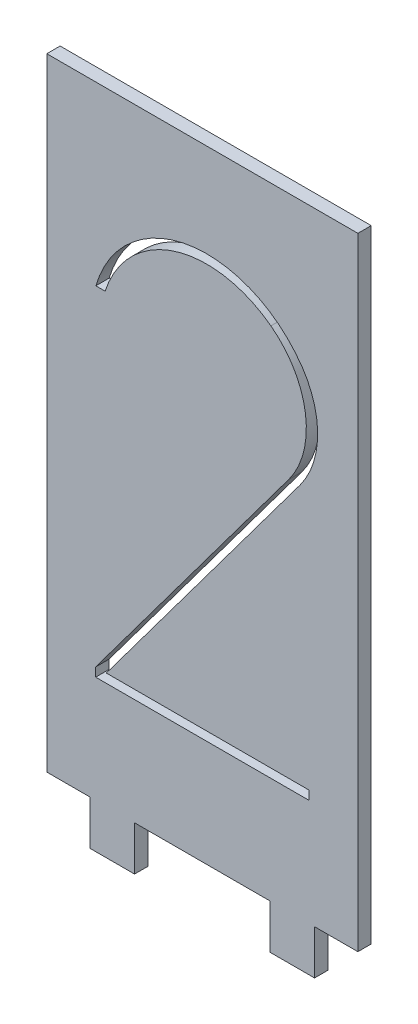
ISO-10303-21;
HEADER;
FILE_DESCRIPTION(('STEP AP214'),'2;1');
FILE_NAME('part.step','',(''),(''),'','','');
FILE_SCHEMA(('AUTOMOTIVE_DESIGN { 1 0 10303 214 1 1 1 1 }'));
ENDSEC;
DATA;
#1=APPLICATION_CONTEXT('core data for automotive mechanical design processes');
#2=APPLICATION_PROTOCOL_DEFINITION('international standard','automotive_design',2000,#1);
#3=PRODUCT_CONTEXT('',#1,'mechanical');
#4=PRODUCT('Part','Part','',(#3));
#5=PRODUCT_RELATED_PRODUCT_CATEGORY('part','',(#4));
#6=PRODUCT_DEFINITION_FORMATION('','',#4);
#7=PRODUCT_DEFINITION_CONTEXT('part definition',#1,'design');
#8=PRODUCT_DEFINITION('design','',#6,#7);
#9=PRODUCT_DEFINITION_SHAPE('','',#8);
#10=(LENGTH_UNIT() NAMED_UNIT(*) SI_UNIT(.MILLI.,.METRE.));
#11=(NAMED_UNIT(*) PLANE_ANGLE_UNIT() SI_UNIT($,.RADIAN.));
#12=(NAMED_UNIT(*) SI_UNIT($,.STERADIAN.) SOLID_ANGLE_UNIT());
#13=UNCERTAINTY_MEASURE_WITH_UNIT(LENGTH_MEASURE(1.E-05),#10,'distance_accuracy_value','');
#14=(GEOMETRIC_REPRESENTATION_CONTEXT(3) GLOBAL_UNCERTAINTY_ASSIGNED_CONTEXT((#13)) GLOBAL_UNIT_ASSIGNED_CONTEXT((#10,
#11,#12)) REPRESENTATION_CONTEXT('',''));
#15=CARTESIAN_POINT('',(0.,0.,0.));
#16=DIRECTION('',(0.,0.,1.));
#17=DIRECTION('',(1.,0.,0.));
#18=AXIS2_PLACEMENT_3D('',#15,#16,#17);
#19=CARTESIAN_POINT('',(0.,0.,1.5));
#20=DIRECTION('',(0.,1.,0.));
#21=DIRECTION('',(0.,0.,1.));
#22=AXIS2_PLACEMENT_3D('',#19,#20,#21);
#23=PLANE('',#22);
#24=DIRECTION('',(1.,0.,0.));
#25=VECTOR('',#24,1.);
#26=CARTESIAN_POINT('',(0.,0.,1.5));
#27=LINE('',#26,#25);
#28=CARTESIAN_POINT('',(4.875,0.,1.5));
#29=VERTEX_POINT('',#28);
#30=CARTESIAN_POINT('',(9.875,0.,1.5));
#31=VERTEX_POINT('',#30);
#32=EDGE_CURVE('E365',#29,#31,#27,.T.);
#33=ORIENTED_EDGE('',*,*,#32,.F.);
#34=DIRECTION('',(0.,0.,1.));
#35=VECTOR('',#34,1.);
#36=CARTESIAN_POINT('',(4.875,0.,-18.5));
#37=LINE('',#36,#35);
#38=CARTESIAN_POINT('',(4.875,0.,0.));
#39=VERTEX_POINT('',#38);
#40=EDGE_CURVE('E302',#39,#29,#37,.T.);
#41=ORIENTED_EDGE('',*,*,#40,.F.);
#42=DIRECTION('',(1.,0.,0.));
#43=VECTOR('',#42,1.);
#44=CARTESIAN_POINT('',(0.,0.,0.));
#45=LINE('',#44,#43);
#46=CARTESIAN_POINT('',(9.875,0.,0.));
#47=VERTEX_POINT('',#46);
#48=EDGE_CURVE('E380',#39,#47,#45,.T.);
#49=ORIENTED_EDGE('',*,*,#48,.T.);
#50=DIRECTION('',(0.,0.,1.));
#51=VECTOR('',#50,1.);
#52=CARTESIAN_POINT('',(9.875,0.,-18.5));
#53=LINE('',#52,#51);
#54=EDGE_CURVE('E342',#47,#31,#53,.T.);
#55=ORIENTED_EDGE('',*,*,#54,.T.);
#56=EDGE_LOOP('',(#33,#41,#49,#55));
#57=FACE_BOUND('',#56,.T.);
#58=ADVANCED_FACE('F38',(#57),#23,.F.);
#59=CARTESIAN_POINT('',(0.,0.,1.5));
#60=DIRECTION('',(1.,0.,0.));
#61=DIRECTION('',(0.,1.,0.));
#62=AXIS2_PLACEMENT_3D('',#59,#60,#61);
#63=PLANE('',#62);
#64=DIRECTION('',(0.,-1.,0.));
#65=VECTOR('',#64,1.);
#66=CARTESIAN_POINT('',(0.,0.,0.));
#67=LINE('',#66,#65);
#68=CARTESIAN_POINT('',(0.,75.,0.));
#69=VERTEX_POINT('',#68);
#70=CARTESIAN_POINT('',(0.,5.,0.));
#71=VERTEX_POINT('',#70);
#72=EDGE_CURVE('E346',#69,#71,#67,.T.);
#73=ORIENTED_EDGE('',*,*,#72,.T.);
#74=DIRECTION('',(0.,0.,1.));
#75=VECTOR('',#74,1.);
#76=CARTESIAN_POINT('',(0.,5.,-18.5));
#77=LINE('',#76,#75);
#78=CARTESIAN_POINT('',(0.,5.,1.5));
#79=VERTEX_POINT('',#78);
#80=EDGE_CURVE('E326',#71,#79,#77,.T.);
#81=ORIENTED_EDGE('',*,*,#80,.T.);
#82=DIRECTION('',(0.,-1.,0.));
#83=VECTOR('',#82,1.);
#84=CARTESIAN_POINT('',(0.,0.,1.5));
#85=LINE('',#84,#83);
#86=CARTESIAN_POINT('',(0.,75.,1.5));
#87=VERTEX_POINT('',#86);
#88=EDGE_CURVE('E356',#87,#79,#85,.T.);
#89=ORIENTED_EDGE('',*,*,#88,.F.);
#90=DIRECTION('',(0.,0.,-1.));
#91=VECTOR('',#90,1.);
#92=CARTESIAN_POINT('',(0.,75.,1.5));
#93=LINE('',#92,#91);
#94=EDGE_CURVE('E372',#87,#69,#93,.T.);
#95=ORIENTED_EDGE('',*,*,#94,.T.);
#96=EDGE_LOOP('',(#73,#81,#89,#95));
#97=FACE_BOUND('',#96,.T.);
#98=ADVANCED_FACE('F466',(#97),#63,.F.);
#99=CARTESIAN_POINT('',(25.125,0.,0.));
#100=VERTEX_POINT('',#99);
#101=CARTESIAN_POINT('',(30.125,0.,0.));
#102=VERTEX_POINT('',#101);
#103=EDGE_CURVE('E376',#100,#102,#45,.T.);
#104=ORIENTED_EDGE('',*,*,#103,.T.);
#105=DIRECTION('',(0.,0.,1.));
#106=VECTOR('',#105,1.);
#107=CARTESIAN_POINT('',(30.125,0.,-18.5));
#108=LINE('',#107,#106);
#109=CARTESIAN_POINT('',(30.125,0.,1.5));
#110=VERTEX_POINT('',#109);
#111=EDGE_CURVE('E306',#102,#110,#108,.T.);
#112=ORIENTED_EDGE('',*,*,#111,.T.);
#113=CARTESIAN_POINT('',(25.125,0.,1.5));
#114=VERTEX_POINT('',#113);
#115=EDGE_CURVE('E360',#114,#110,#27,.T.);
#116=ORIENTED_EDGE('',*,*,#115,.F.);
#117=DIRECTION('',(0.,0.,1.));
#118=VECTOR('',#117,1.);
#119=CARTESIAN_POINT('',(25.125,0.,-18.5));
#120=LINE('',#119,#118);
#121=EDGE_CURVE('E350',#100,#114,#120,.T.);
#122=ORIENTED_EDGE('',*,*,#121,.F.);
#123=EDGE_LOOP('',(#104,#112,#116,#122));
#124=FACE_BOUND('',#123,.T.);
#125=ADVANCED_FACE('F488',(#124),#23,.F.);
#126=CARTESIAN_POINT('',(35.,0.,1.5));
#127=DIRECTION('',(-1.,0.,0.));
#128=DIRECTION('',(0.,-1.,0.));
#129=AXIS2_PLACEMENT_3D('',#126,#127,#128);
#130=PLANE('',#129);
#131=DIRECTION('',(0.,1.,0.));
#132=VECTOR('',#131,1.);
#133=CARTESIAN_POINT('',(35.,0.,1.5));
#134=LINE('',#133,#132);
#135=CARTESIAN_POINT('',(35.,5.,1.5));
#136=VERTEX_POINT('',#135);
#137=CARTESIAN_POINT('',(35.,75.,1.5));
#138=VERTEX_POINT('',#137);
#139=EDGE_CURVE('E366',#136,#138,#134,.T.);
#140=ORIENTED_EDGE('',*,*,#139,.F.);
#141=DIRECTION('',(0.,0.,1.));
#142=VECTOR('',#141,1.);
#143=CARTESIAN_POINT('',(35.,5.,-18.5));
#144=LINE('',#143,#142);
#145=CARTESIAN_POINT('',(35.,5.,0.));
#146=VERTEX_POINT('',#145);
#147=EDGE_CURVE('E311',#146,#136,#144,.T.);
#148=ORIENTED_EDGE('',*,*,#147,.F.);
#149=DIRECTION('',(0.,1.,0.));
#150=VECTOR('',#149,1.);
#151=CARTESIAN_POINT('',(35.,0.,0.));
#152=LINE('',#151,#150);
#153=CARTESIAN_POINT('',(35.,75.,0.));
#154=VERTEX_POINT('',#153);
#155=EDGE_CURVE('E381',#146,#154,#152,.T.);
#156=ORIENTED_EDGE('',*,*,#155,.T.);
#157=DIRECTION('',(0.,0.,-1.));
#158=VECTOR('',#157,1.);
#159=CARTESIAN_POINT('',(35.,75.,1.5));
#160=LINE('',#159,#158);
#161=EDGE_CURVE('E389',#138,#154,#160,.T.);
#162=ORIENTED_EDGE('',*,*,#161,.F.);
#163=EDGE_LOOP('',(#140,#148,#156,#162));
#164=FACE_BOUND('',#163,.T.);
#165=ADVANCED_FACE('F479',(#164),#130,.F.);
#166=CARTESIAN_POINT('',(0.,75.,1.5));
#167=DIRECTION('',(0.,-1.,0.));
#168=DIRECTION('',(0.,0.,-1.));
#169=AXIS2_PLACEMENT_3D('',#166,#167,#168);
#170=PLANE('',#169);
#171=DIRECTION('',(-1.,0.,0.));
#172=VECTOR('',#171,1.);
#173=CARTESIAN_POINT('',(0.,75.,0.));
#174=LINE('',#173,#172);
#175=EDGE_CURVE('E361',#154,#69,#174,.T.);
#176=ORIENTED_EDGE('',*,*,#175,.T.);
#177=ORIENTED_EDGE('',*,*,#94,.F.);
#178=DIRECTION('',(-1.,0.,0.));
#179=VECTOR('',#178,1.);
#180=CARTESIAN_POINT('',(0.,75.,1.5));
#181=LINE('',#180,#179);
#182=EDGE_CURVE('E369',#138,#87,#181,.T.);
#183=ORIENTED_EDGE('',*,*,#182,.F.);
#184=ORIENTED_EDGE('',*,*,#161,.T.);
#185=EDGE_LOOP('',(#176,#177,#183,#184));
#186=FACE_BOUND('',#185,.T.);
#187=ADVANCED_FACE('F471',(#186),#170,.F.);
#188=CARTESIAN_POINT('',(0.,0.,1.5));
#189=DIRECTION('',(0.,0.,-1.));
#190=DIRECTION('',(-1.,0.,0.));
#191=AXIS2_PLACEMENT_3D('',#188,#189,#190);
#192=PLANE('',#191);
#193=DIRECTION('',(-0.59786551853371,-0.801596420743268,0.));
#194=VECTOR('',#193,1.);
#195=CARTESIAN_POINT('',(29.9808930630456,50.8230942370857,1.5));
#196=LINE('',#195,#194);
#197=CARTESIAN_POINT('',(27.2185296667036,47.1194175026745,1.5));
#198=VERTEX_POINT('',#197);
#199=CARTESIAN_POINT('',(5.49999999999999,18.,1.5));
#200=VERTEX_POINT('',#199);
#201=EDGE_CURVE('E257',#198,#200,#196,.T.);
#202=ORIENTED_EDGE('',*,*,#201,.F.);
#203=CARTESIAN_POINT('',(19.2025654592709,53.0980726880116,1.5));
#204=DIRECTION('',(0.,0.,-1.));
#205=DIRECTION('',(-1.,0.,0.));
#206=AXIS2_PLACEMENT_3D('',#203,#204,#205);
#207=CIRCLE('',#206,10.);
#208=CARTESIAN_POINT('',(25.2153927556252,61.0884361280696,1.5));
#209=VERTEX_POINT('',#208);
#210=EDGE_CURVE('E61',#198,#209,#207,.F.);
#211=ORIENTED_EDGE('',*,*,#210,.T.);
#212=CARTESIAN_POINT('',(18.,51.5,1.5));
#213=DIRECTION('',(0.,0.,-1.));
#214=DIRECTION('',(-1.,0.,0.));
#215=AXIS2_PLACEMENT_3D('',#212,#213,#214);
#216=CIRCLE('',#215,12.);
#217=CARTESIAN_POINT('',(6.5662215065745,55.142623966769,1.5));
#218=VERTEX_POINT('',#217);
#219=EDGE_CURVE('E254',#218,#209,#216,.T.);
#220=ORIENTED_EDGE('',*,*,#219,.F.);
#221=DIRECTION('',(1.,0.,0.));
#222=VECTOR('',#221,1.);
#223=CARTESIAN_POINT('',(6.5662215065745,55.142623966769,1.5));
#224=LINE('',#223,#222);
#225=CARTESIAN_POINT('',(5.52076562297513,55.1426239667691,1.5));
#226=VERTEX_POINT('',#225);
#227=EDGE_CURVE('E251',#226,#218,#224,.T.);
#228=ORIENTED_EDGE('',*,*,#227,.F.);
#229=CARTESIAN_POINT('',(18.,51.5,1.5));
#230=DIRECTION('',(0.,0.,1.));
#231=DIRECTION('',(-1.,0.,0.));
#232=AXIS2_PLACEMENT_3D('',#229,#230,#231);
#233=CIRCLE('',#232,13.);
#234=CARTESIAN_POINT('',(28.7253216550467,58.8462558760083,1.5));
#235=VERTEX_POINT('',#234);
#236=EDGE_CURVE('E212',#235,#226,#233,.T.);
#237=ORIENTED_EDGE('',*,*,#236,.F.);
#238=CARTESIAN_POINT('',(20.4750742280877,53.1952898175404,1.5));
#239=DIRECTION('',(0.,0.,-1.));
#240=DIRECTION('',(-1.,0.,0.));
#241=AXIS2_PLACEMENT_3D('',#238,#239,#240);
#242=CIRCLE('',#241,10.);
#243=CARTESIAN_POINT('',(28.4910384355204,47.2166346322033,1.5));
#244=VERTEX_POINT('',#243);
#245=EDGE_CURVE('E422',#235,#244,#242,.T.);
#246=ORIENTED_EDGE('',*,*,#245,.T.);
#247=DIRECTION('',(0.59786551853371,0.801596420743268,0.));
#248=VECTOR('',#247,1.);
#249=CARTESIAN_POINT('',(6.69999999999999,18.,1.5));
#250=LINE('',#249,#248);
#251=CARTESIAN_POINT('',(6.69999999999999,18.,1.5));
#252=VERTEX_POINT('',#251);
#253=EDGE_CURVE('E206',#252,#244,#250,.T.);
#254=ORIENTED_EDGE('',*,*,#253,.F.);
#255=DIRECTION('',(-1.,0.,0.));
#256=VECTOR('',#255,1.);
#257=CARTESIAN_POINT('',(29.5,18.,1.5));
#258=LINE('',#257,#256);
#259=CARTESIAN_POINT('',(29.5,18.,1.5));
#260=VERTEX_POINT('',#259);
#261=EDGE_CURVE('E272',#260,#252,#258,.T.);
#262=ORIENTED_EDGE('',*,*,#261,.F.);
#263=DIRECTION('',(0.,1.,0.));
#264=VECTOR('',#263,1.);
#265=CARTESIAN_POINT('',(29.5,17.,1.5));
#266=LINE('',#265,#264);
#267=CARTESIAN_POINT('',(29.5,17.,1.5));
#268=VERTEX_POINT('',#267);
#269=EDGE_CURVE('E268',#268,#260,#266,.T.);
#270=ORIENTED_EDGE('',*,*,#269,.F.);
#271=DIRECTION('',(1.,0.,0.));
#272=VECTOR('',#271,1.);
#273=CARTESIAN_POINT('',(5.49999999999999,17.,1.5));
#274=LINE('',#273,#272);
#275=CARTESIAN_POINT('',(5.49999999999999,17.,1.5));
#276=VERTEX_POINT('',#275);
#277=EDGE_CURVE('E264',#276,#268,#274,.T.);
#278=ORIENTED_EDGE('',*,*,#277,.F.);
#279=DIRECTION('',(0.,-1.,0.));
#280=VECTOR('',#279,1.);
#281=CARTESIAN_POINT('',(5.49999999999999,18.,1.5));
#282=LINE('',#281,#280);
#283=EDGE_CURVE('E260',#200,#276,#282,.T.);
#284=ORIENTED_EDGE('',*,*,#283,.F.);
#285=EDGE_LOOP('',(#202,#211,#220,#228,#237,#246,#254,#262,#270,#278,#284));
#286=FACE_BOUND('',#285,.T.);
#287=DIRECTION('',(-1.,0.,0.));
#288=VECTOR('',#287,1.);
#289=CARTESIAN_POINT('',(4.875,5.,1.5));
#290=LINE('',#289,#288);
#291=CARTESIAN_POINT('',(4.875,5.,1.5));
#292=VERTEX_POINT('',#291);
#293=EDGE_CURVE('E320',#292,#79,#290,.T.);
#294=ORIENTED_EDGE('',*,*,#293,.F.);
#295=DIRECTION('',(0.,1.,0.));
#296=VECTOR('',#295,1.);
#297=CARTESIAN_POINT('',(4.875,5.,1.5));
#298=LINE('',#297,#296);
#299=EDGE_CURVE('E282',#29,#292,#298,.T.);
#300=ORIENTED_EDGE('',*,*,#299,.F.);
#301=ORIENTED_EDGE('',*,*,#32,.T.);
#302=DIRECTION('',(0.,-1.,0.));
#303=VECTOR('',#302,1.);
#304=CARTESIAN_POINT('',(9.875,0.,1.5));
#305=LINE('',#304,#303);
#306=CARTESIAN_POINT('',(9.875,5.,1.5));
#307=VERTEX_POINT('',#306);
#308=EDGE_CURVE('E310',#307,#31,#305,.T.);
#309=ORIENTED_EDGE('',*,*,#308,.F.);
#310=DIRECTION('',(-1.,0.,0.));
#311=VECTOR('',#310,1.);
#312=CARTESIAN_POINT('',(9.875,5.,1.5));
#313=LINE('',#312,#311);
#314=CARTESIAN_POINT('',(25.125,5.,1.5));
#315=VERTEX_POINT('',#314);
#316=EDGE_CURVE('E338',#315,#307,#313,.T.);
#317=ORIENTED_EDGE('',*,*,#316,.F.);
#318=DIRECTION('',(0.,1.,0.));
#319=VECTOR('',#318,1.);
#320=CARTESIAN_POINT('',(25.125,0.,1.5));
#321=LINE('',#320,#319);
#322=EDGE_CURVE('E334',#114,#315,#321,.T.);
#323=ORIENTED_EDGE('',*,*,#322,.F.);
#324=ORIENTED_EDGE('',*,*,#115,.T.);
#325=DIRECTION('',(0.,-1.,0.));
#326=VECTOR('',#325,1.);
#327=CARTESIAN_POINT('',(30.125,5.,1.5));
#328=LINE('',#327,#326);
#329=CARTESIAN_POINT('',(30.125,5.,1.5));
#330=VERTEX_POINT('',#329);
#331=EDGE_CURVE('E298',#330,#110,#328,.T.);
#332=ORIENTED_EDGE('',*,*,#331,.F.);
#333=DIRECTION('',(-1.,0.,0.));
#334=VECTOR('',#333,1.);
#335=CARTESIAN_POINT('',(30.125,5.,1.5));
#336=LINE('',#335,#334);
#337=EDGE_CURVE('E301',#136,#330,#336,.T.);
#338=ORIENTED_EDGE('',*,*,#337,.F.);
#339=ORIENTED_EDGE('',*,*,#139,.T.);
#340=ORIENTED_EDGE('',*,*,#182,.T.);
#341=ORIENTED_EDGE('',*,*,#88,.T.);
#342=EDGE_LOOP('',(#294,#300,#301,#309,#317,#323,#324,#332,#338,#339,#340,#341));
#343=FACE_BOUND('',#342,.T.);
#344=ADVANCED_FACE('F456',(#286,#343),#192,.F.);
#345=CARTESIAN_POINT('',(0.,0.,0.));
#346=DIRECTION('',(0.,0.,-1.));
#347=DIRECTION('',(-1.,0.,0.));
#348=AXIS2_PLACEMENT_3D('',#345,#346,#347);
#349=PLANE('',#348);
#350=CARTESIAN_POINT('',(18.,51.5,0.));
#351=DIRECTION('',(0.,0.,-1.));
#352=DIRECTION('',(-1.,0.,0.));
#353=AXIS2_PLACEMENT_3D('',#350,#351,#352);
#354=CIRCLE('',#353,12.);
#355=CARTESIAN_POINT('',(6.5662215065745,55.142623966769,0.));
#356=VERTEX_POINT('',#355);
#357=CARTESIAN_POINT('',(25.2153927556252,61.0884361280696,0.));
#358=VERTEX_POINT('',#357);
#359=EDGE_CURVE('E223',#356,#358,#354,.T.);
#360=ORIENTED_EDGE('',*,*,#359,.T.);
#361=CARTESIAN_POINT('',(19.2025654592709,53.0980726880116,0.));
#362=DIRECTION('',(0.,0.,-1.));
#363=DIRECTION('',(-1.,0.,0.));
#364=AXIS2_PLACEMENT_3D('',#361,#362,#363);
#365=CIRCLE('',#364,10.);
#366=CARTESIAN_POINT('',(27.2185296667036,47.1194175026745,0.));
#367=VERTEX_POINT('',#366);
#368=EDGE_CURVE('E11',#358,#367,#365,.T.);
#369=ORIENTED_EDGE('',*,*,#368,.T.);
#370=DIRECTION('',(-0.59786551853371,-0.801596420743268,0.));
#371=VECTOR('',#370,1.);
#372=CARTESIAN_POINT('',(29.9808930630456,50.8230942370857,0.));
#373=LINE('',#372,#371);
#374=CARTESIAN_POINT('',(5.49999999999999,18.,0.));
#375=VERTEX_POINT('',#374);
#376=EDGE_CURVE('E226',#367,#375,#373,.T.);
#377=ORIENTED_EDGE('',*,*,#376,.T.);
#378=DIRECTION('',(0.,-1.,0.));
#379=VECTOR('',#378,1.);
#380=CARTESIAN_POINT('',(5.49999999999999,18.,0.));
#381=LINE('',#380,#379);
#382=CARTESIAN_POINT('',(5.49999999999999,17.,0.));
#383=VERTEX_POINT('',#382);
#384=EDGE_CURVE('E231',#375,#383,#381,.T.);
#385=ORIENTED_EDGE('',*,*,#384,.T.);
#386=DIRECTION('',(1.,0.,0.));
#387=VECTOR('',#386,1.);
#388=CARTESIAN_POINT('',(5.49999999999999,17.,0.));
#389=LINE('',#388,#387);
#390=CARTESIAN_POINT('',(29.5,17.,0.));
#391=VERTEX_POINT('',#390);
#392=EDGE_CURVE('E235',#383,#391,#389,.T.);
#393=ORIENTED_EDGE('',*,*,#392,.T.);
#394=DIRECTION('',(0.,1.,0.));
#395=VECTOR('',#394,1.);
#396=CARTESIAN_POINT('',(29.5,17.,0.));
#397=LINE('',#396,#395);
#398=CARTESIAN_POINT('',(29.5,18.,0.));
#399=VERTEX_POINT('',#398);
#400=EDGE_CURVE('E239',#391,#399,#397,.T.);
#401=ORIENTED_EDGE('',*,*,#400,.T.);
#402=DIRECTION('',(-1.,0.,0.));
#403=VECTOR('',#402,1.);
#404=CARTESIAN_POINT('',(29.5,18.,0.));
#405=LINE('',#404,#403);
#406=CARTESIAN_POINT('',(6.69999999999999,18.,0.));
#407=VERTEX_POINT('',#406);
#408=EDGE_CURVE('E243',#399,#407,#405,.T.);
#409=ORIENTED_EDGE('',*,*,#408,.T.);
#410=DIRECTION('',(0.59786551853371,0.801596420743268,0.));
#411=VECTOR('',#410,1.);
#412=CARTESIAN_POINT('',(6.69999999999999,18.,0.));
#413=LINE('',#412,#411);
#414=CARTESIAN_POINT('',(28.4910384355204,47.2166346322033,0.));
#415=VERTEX_POINT('',#414);
#416=EDGE_CURVE('E218',#407,#415,#413,.T.);
#417=ORIENTED_EDGE('',*,*,#416,.T.);
#418=CARTESIAN_POINT('',(20.4750742280877,53.1952898175404,0.));
#419=DIRECTION('',(0.,0.,-1.));
#420=DIRECTION('',(-1.,0.,0.));
#421=AXIS2_PLACEMENT_3D('',#418,#419,#420);
#422=CIRCLE('',#421,10.);
#423=CARTESIAN_POINT('',(28.7253216550467,58.8462558760083,0.));
#424=VERTEX_POINT('',#423);
#425=EDGE_CURVE('E201',#415,#424,#422,.F.);
#426=ORIENTED_EDGE('',*,*,#425,.T.);
#427=CARTESIAN_POINT('',(18.,51.5,0.));
#428=DIRECTION('',(0.,0.,1.));
#429=DIRECTION('',(-1.,0.,0.));
#430=AXIS2_PLACEMENT_3D('',#427,#428,#429);
#431=CIRCLE('',#430,13.);
#432=CARTESIAN_POINT('',(5.52076562297513,55.1426239667691,0.));
#433=VERTEX_POINT('',#432);
#434=EDGE_CURVE('E193',#424,#433,#431,.T.);
#435=ORIENTED_EDGE('',*,*,#434,.T.);
#436=DIRECTION('',(1.,0.,0.));
#437=VECTOR('',#436,1.);
#438=CARTESIAN_POINT('',(6.5662215065745,55.142623966769,0.));
#439=LINE('',#438,#437);
#440=EDGE_CURVE('E198',#433,#356,#439,.T.);
#441=ORIENTED_EDGE('',*,*,#440,.T.);
#442=EDGE_LOOP('',(#360,#369,#377,#385,#393,#401,#409,#417,#426,#435,#441));
#443=FACE_BOUND('',#442,.T.);
#444=DIRECTION('',(0.,-1.,0.));
#445=VECTOR('',#444,1.);
#446=CARTESIAN_POINT('',(4.875,0.,0.));
#447=LINE('',#446,#445);
#448=CARTESIAN_POINT('',(4.875,5.,0.));
#449=VERTEX_POINT('',#448);
#450=EDGE_CURVE('E413',#449,#39,#447,.T.);
#451=ORIENTED_EDGE('',*,*,#450,.F.);
#452=DIRECTION('',(1.,0.,0.));
#453=VECTOR('',#452,1.);
#454=CARTESIAN_POINT('',(0.,5.,0.));
#455=LINE('',#454,#453);
#456=EDGE_CURVE('E410',#71,#449,#455,.T.);
#457=ORIENTED_EDGE('',*,*,#456,.F.);
#458=ORIENTED_EDGE('',*,*,#72,.F.);
#459=ORIENTED_EDGE('',*,*,#175,.F.);
#460=ORIENTED_EDGE('',*,*,#155,.F.);
#461=DIRECTION('',(1.,0.,0.));
#462=VECTOR('',#461,1.);
#463=CARTESIAN_POINT('',(0.,5.,0.));
#464=LINE('',#463,#462);
#465=CARTESIAN_POINT('',(30.125,5.,0.));
#466=VERTEX_POINT('',#465);
#467=EDGE_CURVE('E403',#466,#146,#464,.T.);
#468=ORIENTED_EDGE('',*,*,#467,.F.);
#469=DIRECTION('',(0.,1.,0.));
#470=VECTOR('',#469,1.);
#471=CARTESIAN_POINT('',(30.125,0.,0.));
#472=LINE('',#471,#470);
#473=EDGE_CURVE('E406',#102,#466,#472,.T.);
#474=ORIENTED_EDGE('',*,*,#473,.F.);
#475=ORIENTED_EDGE('',*,*,#103,.F.);
#476=DIRECTION('',(0.,-1.,0.));
#477=VECTOR('',#476,1.);
#478=CARTESIAN_POINT('',(25.125,0.,0.));
#479=LINE('',#478,#477);
#480=CARTESIAN_POINT('',(25.125,5.,0.));
#481=VERTEX_POINT('',#480);
#482=EDGE_CURVE('E393',#481,#100,#479,.T.);
#483=ORIENTED_EDGE('',*,*,#482,.F.);
#484=DIRECTION('',(1.,0.,0.));
#485=VECTOR('',#484,1.);
#486=CARTESIAN_POINT('',(0.,5.,0.));
#487=LINE('',#486,#485);
#488=CARTESIAN_POINT('',(9.875,5.,0.));
#489=VERTEX_POINT('',#488);
#490=EDGE_CURVE('E396',#489,#481,#487,.T.);
#491=ORIENTED_EDGE('',*,*,#490,.F.);
#492=DIRECTION('',(0.,1.,0.));
#493=VECTOR('',#492,1.);
#494=CARTESIAN_POINT('',(9.875,0.,0.));
#495=LINE('',#494,#493);
#496=EDGE_CURVE('E400',#47,#489,#495,.T.);
#497=ORIENTED_EDGE('',*,*,#496,.F.);
#498=ORIENTED_EDGE('',*,*,#48,.F.);
#499=EDGE_LOOP('',(#451,#457,#458,#459,#460,#468,#474,#475,#483,#491,#497,#498));
#500=FACE_BOUND('',#499,.T.);
#501=ADVANCED_FACE('F195',(#443,#500),#349,.T.);
#502=CARTESIAN_POINT('',(9.875,0.,-18.5));
#503=DIRECTION('',(-1.,0.,0.));
#504=DIRECTION('',(0.,-1.,0.));
#505=AXIS2_PLACEMENT_3D('',#502,#503,#504);
#506=PLANE('',#505);
#507=ORIENTED_EDGE('',*,*,#496,.T.);
#508=DIRECTION('',(0.,0.,1.));
#509=VECTOR('',#508,1.);
#510=CARTESIAN_POINT('',(9.875,5.,-18.5));
#511=LINE('',#510,#509);
#512=EDGE_CURVE('E343',#489,#307,#511,.T.);
#513=ORIENTED_EDGE('',*,*,#512,.T.);
#514=ORIENTED_EDGE('',*,*,#308,.T.);
#515=ORIENTED_EDGE('',*,*,#54,.F.);
#516=EDGE_LOOP('',(#507,#513,#514,#515));
#517=FACE_BOUND('',#516,.T.);
#518=ADVANCED_FACE('F448',(#517),#506,.F.);
#519=CARTESIAN_POINT('',(9.875,5.,-18.5));
#520=DIRECTION('',(0.,1.,0.));
#521=DIRECTION('',(0.,0.,1.));
#522=AXIS2_PLACEMENT_3D('',#519,#520,#521);
#523=PLANE('',#522);
#524=ORIENTED_EDGE('',*,*,#490,.T.);
#525=DIRECTION('',(0.,0.,1.));
#526=VECTOR('',#525,1.);
#527=CARTESIAN_POINT('',(25.125,5.,-18.5));
#528=LINE('',#527,#526);
#529=EDGE_CURVE('E347',#481,#315,#528,.T.);
#530=ORIENTED_EDGE('',*,*,#529,.T.);
#531=ORIENTED_EDGE('',*,*,#316,.T.);
#532=ORIENTED_EDGE('',*,*,#512,.F.);
#533=EDGE_LOOP('',(#524,#530,#531,#532));
#534=FACE_BOUND('',#533,.T.);
#535=ADVANCED_FACE('F450',(#534),#523,.F.);
#536=CARTESIAN_POINT('',(25.125,0.,-18.5));
#537=DIRECTION('',(1.,0.,0.));
#538=DIRECTION('',(0.,0.,-1.));
#539=AXIS2_PLACEMENT_3D('',#536,#537,#538);
#540=PLANE('',#539);
#541=ORIENTED_EDGE('',*,*,#482,.T.);
#542=ORIENTED_EDGE('',*,*,#121,.T.);
#543=ORIENTED_EDGE('',*,*,#322,.T.);
#544=ORIENTED_EDGE('',*,*,#529,.F.);
#545=EDGE_LOOP('',(#541,#542,#543,#544));
#546=FACE_BOUND('',#545,.T.);
#547=ADVANCED_FACE('F492',(#546),#540,.F.);
#548=CARTESIAN_POINT('',(30.125,5.,-18.5));
#549=DIRECTION('',(-1.,0.,0.));
#550=DIRECTION('',(0.,0.,1.));
#551=AXIS2_PLACEMENT_3D('',#548,#549,#550);
#552=PLANE('',#551);
#553=ORIENTED_EDGE('',*,*,#473,.T.);
#554=DIRECTION('',(0.,0.,1.));
#555=VECTOR('',#554,1.);
#556=CARTESIAN_POINT('',(30.125,5.,-18.5));
#557=LINE('',#556,#555);
#558=EDGE_CURVE('E307',#466,#330,#557,.T.);
#559=ORIENTED_EDGE('',*,*,#558,.T.);
#560=ORIENTED_EDGE('',*,*,#331,.T.);
#561=ORIENTED_EDGE('',*,*,#111,.F.);
#562=EDGE_LOOP('',(#553,#559,#560,#561));
#563=FACE_BOUND('',#562,.T.);
#564=ADVANCED_FACE('F486',(#563),#552,.F.);
#565=CARTESIAN_POINT('',(30.125,5.,-18.5));
#566=DIRECTION('',(0.,1.,0.));
#567=DIRECTION('',(0.,0.,1.));
#568=AXIS2_PLACEMENT_3D('',#565,#566,#567);
#569=PLANE('',#568);
#570=ORIENTED_EDGE('',*,*,#467,.T.);
#571=ORIENTED_EDGE('',*,*,#147,.T.);
#572=ORIENTED_EDGE('',*,*,#337,.T.);
#573=ORIENTED_EDGE('',*,*,#558,.F.);
#574=EDGE_LOOP('',(#570,#571,#572,#573));
#575=FACE_BOUND('',#574,.T.);
#576=ADVANCED_FACE('F482',(#575),#569,.F.);
#577=CARTESIAN_POINT('',(4.875,5.,-18.5));
#578=DIRECTION('',(1.,0.,0.));
#579=DIRECTION('',(0.,1.,0.));
#580=AXIS2_PLACEMENT_3D('',#577,#578,#579);
#581=PLANE('',#580);
#582=ORIENTED_EDGE('',*,*,#450,.T.);
#583=ORIENTED_EDGE('',*,*,#40,.T.);
#584=ORIENTED_EDGE('',*,*,#299,.T.);
#585=DIRECTION('',(0.,0.,1.));
#586=VECTOR('',#585,1.);
#587=CARTESIAN_POINT('',(4.875,5.,-18.5));
#588=LINE('',#587,#586);
#589=EDGE_CURVE('E323',#449,#292,#588,.T.);
#590=ORIENTED_EDGE('',*,*,#589,.F.);
#591=EDGE_LOOP('',(#582,#583,#584,#590));
#592=FACE_BOUND('',#591,.T.);
#593=ADVANCED_FACE('F460',(#592),#581,.F.);
#594=CARTESIAN_POINT('',(4.875,5.,-18.5));
#595=DIRECTION('',(0.,1.,0.));
#596=DIRECTION('',(-1.,0.,0.));
#597=AXIS2_PLACEMENT_3D('',#594,#595,#596);
#598=PLANE('',#597);
#599=ORIENTED_EDGE('',*,*,#456,.T.);
#600=ORIENTED_EDGE('',*,*,#589,.T.);
#601=ORIENTED_EDGE('',*,*,#293,.T.);
#602=ORIENTED_EDGE('',*,*,#80,.F.);
#603=EDGE_LOOP('',(#599,#600,#601,#602));
#604=FACE_BOUND('',#603,.T.);
#605=ADVANCED_FACE('F462',(#604),#598,.F.);
#606=CARTESIAN_POINT('',(18.,51.5,0.));
#607=DIRECTION('',(0.,0.,1.));
#608=DIRECTION('',(1.,0.,0.));
#609=AXIS2_PLACEMENT_3D('',#606,#607,#608);
#610=CYLINDRICAL_SURFACE('',#609,13.);
#611=ORIENTED_EDGE('',*,*,#434,.F.);
#612=DIRECTION('',(0.,0.,1.));
#613=VECTOR('',#612,1.);
#614=CARTESIAN_POINT('',(28.7253216550467,58.8462558760083,0.));
#615=LINE('',#614,#613);
#616=EDGE_CURVE('E416',#424,#235,#615,.T.);
#617=ORIENTED_EDGE('',*,*,#616,.T.);
#618=ORIENTED_EDGE('',*,*,#236,.T.);
#619=DIRECTION('',(0.,0.,1.));
#620=VECTOR('',#619,1.);
#621=CARTESIAN_POINT('',(5.52076562297513,55.1426239667691,0.));
#622=LINE('',#621,#620);
#623=EDGE_CURVE('E209',#433,#226,#622,.T.);
#624=ORIENTED_EDGE('',*,*,#623,.F.);
#625=EDGE_LOOP('',(#611,#617,#618,#624));
#626=FACE_BOUND('',#625,.T.);
#627=ADVANCED_FACE('F210',(#626),#610,.F.);
#628=CARTESIAN_POINT('',(6.69999999999999,18.,0.));
#629=DIRECTION('',(0.801596420743268,-0.597865518533709,0.));
#630=DIRECTION('',(0.59786551853371,0.801596420743268,0.));
#631=AXIS2_PLACEMENT_3D('',#628,#629,#630);
#632=PLANE('',#631);
#633=ORIENTED_EDGE('',*,*,#253,.T.);
#634=DIRECTION('',(0.,0.,-1.));
#635=VECTOR('',#634,1.);
#636=CARTESIAN_POINT('',(28.4910384355204,47.2166346322033,0.));
#637=LINE('',#636,#635);
#638=EDGE_CURVE('E419',#244,#415,#637,.T.);
#639=ORIENTED_EDGE('',*,*,#638,.T.);
#640=ORIENTED_EDGE('',*,*,#416,.F.);
#641=DIRECTION('',(0.,0.,1.));
#642=VECTOR('',#641,1.);
#643=CARTESIAN_POINT('',(6.69999999999999,18.,0.));
#644=LINE('',#643,#642);
#645=EDGE_CURVE('E279',#407,#252,#644,.T.);
#646=ORIENTED_EDGE('',*,*,#645,.T.);
#647=EDGE_LOOP('',(#633,#639,#640,#646));
#648=FACE_BOUND('',#647,.T.);
#649=ADVANCED_FACE('F579',(#648),#632,.F.);
#650=CARTESIAN_POINT('',(29.5,18.,0.));
#651=DIRECTION('',(0.,1.,0.));
#652=DIRECTION('',(-1.,0.,0.));
#653=AXIS2_PLACEMENT_3D('',#650,#651,#652);
#654=PLANE('',#653);
#655=ORIENTED_EDGE('',*,*,#261,.T.);
#656=ORIENTED_EDGE('',*,*,#645,.F.);
#657=ORIENTED_EDGE('',*,*,#408,.F.);
#658=DIRECTION('',(0.,0.,1.));
#659=VECTOR('',#658,1.);
#660=CARTESIAN_POINT('',(29.5,18.,0.));
#661=LINE('',#660,#659);
#662=EDGE_CURVE('E283',#399,#260,#661,.T.);
#663=ORIENTED_EDGE('',*,*,#662,.T.);
#664=EDGE_LOOP('',(#655,#656,#657,#663));
#665=FACE_BOUND('',#664,.T.);
#666=ADVANCED_FACE('F573',(#665),#654,.F.);
#667=CARTESIAN_POINT('',(29.5,17.,0.));
#668=DIRECTION('',(1.,0.,0.));
#669=DIRECTION('',(0.,0.,-1.));
#670=AXIS2_PLACEMENT_3D('',#667,#668,#669);
#671=PLANE('',#670);
#672=ORIENTED_EDGE('',*,*,#269,.T.);
#673=ORIENTED_EDGE('',*,*,#662,.F.);
#674=ORIENTED_EDGE('',*,*,#400,.F.);
#675=DIRECTION('',(0.,0.,1.));
#676=VECTOR('',#675,1.);
#677=CARTESIAN_POINT('',(29.5,17.,0.));
#678=LINE('',#677,#676);
#679=EDGE_CURVE('E286',#391,#268,#678,.T.);
#680=ORIENTED_EDGE('',*,*,#679,.T.);
#681=EDGE_LOOP('',(#672,#673,#674,#680));
#682=FACE_BOUND('',#681,.T.);
#683=ADVANCED_FACE('F578',(#682),#671,.F.);
#684=CARTESIAN_POINT('',(5.49999999999999,17.,0.));
#685=DIRECTION('',(0.,-1.,0.));
#686=DIRECTION('',(0.,0.,-1.));
#687=AXIS2_PLACEMENT_3D('',#684,#685,#686);
#688=PLANE('',#687);
#689=ORIENTED_EDGE('',*,*,#277,.T.);
#690=ORIENTED_EDGE('',*,*,#679,.F.);
#691=ORIENTED_EDGE('',*,*,#392,.F.);
#692=DIRECTION('',(0.,0.,1.));
#693=VECTOR('',#692,1.);
#694=CARTESIAN_POINT('',(5.49999999999999,17.,0.));
#695=LINE('',#694,#693);
#696=EDGE_CURVE('E289',#383,#276,#695,.T.);
#697=ORIENTED_EDGE('',*,*,#696,.T.);
#698=EDGE_LOOP('',(#689,#690,#691,#697));
#699=FACE_BOUND('',#698,.T.);
#700=ADVANCED_FACE('F591',(#699),#688,.F.);
#701=CARTESIAN_POINT('',(5.49999999999999,18.,0.));
#702=DIRECTION('',(-1.,0.,0.));
#703=DIRECTION('',(0.,0.,1.));
#704=AXIS2_PLACEMENT_3D('',#701,#702,#703);
#705=PLANE('',#704);
#706=ORIENTED_EDGE('',*,*,#283,.T.);
#707=ORIENTED_EDGE('',*,*,#696,.F.);
#708=ORIENTED_EDGE('',*,*,#384,.F.);
#709=DIRECTION('',(0.,0.,1.));
#710=VECTOR('',#709,1.);
#711=CARTESIAN_POINT('',(5.49999999999999,18.,0.));
#712=LINE('',#711,#710);
#713=EDGE_CURVE('E292',#375,#200,#712,.T.);
#714=ORIENTED_EDGE('',*,*,#713,.T.);
#715=EDGE_LOOP('',(#706,#707,#708,#714));
#716=FACE_BOUND('',#715,.T.);
#717=ADVANCED_FACE('F601',(#716),#705,.F.);
#718=CARTESIAN_POINT('',(29.9808930630456,50.8230942370857,0.));
#719=DIRECTION('',(-0.801596420743268,0.59786551853371,0.));
#720=DIRECTION('',(-0.59786551853371,-0.801596420743268,0.));
#721=AXIS2_PLACEMENT_3D('',#718,#719,#720);
#722=PLANE('',#721);
#723=ORIENTED_EDGE('',*,*,#376,.F.);
#724=DIRECTION('',(0.,0.,1.));
#725=VECTOR('',#724,1.);
#726=CARTESIAN_POINT('',(27.2185296667036,47.1194175026745,0.));
#727=LINE('',#726,#725);
#728=EDGE_CURVE('E427',#367,#198,#727,.T.);
#729=ORIENTED_EDGE('',*,*,#728,.T.);
#730=ORIENTED_EDGE('',*,*,#201,.T.);
#731=ORIENTED_EDGE('',*,*,#713,.F.);
#732=EDGE_LOOP('',(#723,#729,#730,#731));
#733=FACE_BOUND('',#732,.T.);
#734=ADVANCED_FACE('F611',(#733),#722,.F.);
#735=CARTESIAN_POINT('',(18.,51.5,0.));
#736=DIRECTION('',(0.,0.,1.));
#737=DIRECTION('',(1.,0.,0.));
#738=AXIS2_PLACEMENT_3D('',#735,#736,#737);
#739=CYLINDRICAL_SURFACE('',#738,12.);
#740=ORIENTED_EDGE('',*,*,#219,.T.);
#741=DIRECTION('',(0.,0.,1.));
#742=VECTOR('',#741,1.);
#743=CARTESIAN_POINT('',(25.2153927556252,61.0884361280696,0.));
#744=LINE('',#743,#742);
#745=EDGE_CURVE('E47',#209,#358,#744,.F.);
#746=ORIENTED_EDGE('',*,*,#745,.T.);
#747=ORIENTED_EDGE('',*,*,#359,.F.);
#748=DIRECTION('',(0.,0.,1.));
#749=VECTOR('',#748,1.);
#750=CARTESIAN_POINT('',(6.5662215065745,55.142623966769,0.));
#751=LINE('',#750,#749);
#752=EDGE_CURVE('E217',#356,#218,#751,.T.);
#753=ORIENTED_EDGE('',*,*,#752,.T.);
#754=EDGE_LOOP('',(#740,#746,#747,#753));
#755=FACE_BOUND('',#754,.T.);
#756=ADVANCED_FACE('F624',(#755),#739,.T.);
#757=CARTESIAN_POINT('',(6.5662215065745,55.142623966769,0.));
#758=DIRECTION('',(0.,-1.,0.));
#759=DIRECTION('',(1.,0.,0.));
#760=AXIS2_PLACEMENT_3D('',#757,#758,#759);
#761=PLANE('',#760);
#762=ORIENTED_EDGE('',*,*,#227,.T.);
#763=ORIENTED_EDGE('',*,*,#752,.F.);
#764=ORIENTED_EDGE('',*,*,#440,.F.);
#765=ORIENTED_EDGE('',*,*,#623,.T.);
#766=EDGE_LOOP('',(#762,#763,#764,#765));
#767=FACE_BOUND('',#766,.T.);
#768=ADVANCED_FACE('F221',(#767),#761,.F.);
#769=CARTESIAN_POINT('',(20.4750742280877,53.1952898175404,0.));
#770=DIRECTION('',(0.,0.,1.));
#771=DIRECTION('',(1.,0.,0.));
#772=AXIS2_PLACEMENT_3D('',#769,#770,#771);
#773=CYLINDRICAL_SURFACE('',#772,10.);
#774=ORIENTED_EDGE('',*,*,#425,.F.);
#775=ORIENTED_EDGE('',*,*,#638,.F.);
#776=ORIENTED_EDGE('',*,*,#245,.F.);
#777=ORIENTED_EDGE('',*,*,#616,.F.);
#778=EDGE_LOOP('',(#774,#775,#776,#777));
#779=FACE_BOUND('',#778,.T.);
#780=ADVANCED_FACE('F623',(#779),#773,.F.);
#781=CARTESIAN_POINT('',(19.2025654592709,53.0980726880116,0.));
#782=DIRECTION('',(0.,0.,1.));
#783=DIRECTION('',(1.,0.,0.));
#784=AXIS2_PLACEMENT_3D('',#781,#782,#783);
#785=CYLINDRICAL_SURFACE('',#784,10.);
#786=ORIENTED_EDGE('',*,*,#368,.F.);
#787=ORIENTED_EDGE('',*,*,#745,.F.);
#788=ORIENTED_EDGE('',*,*,#210,.F.);
#789=ORIENTED_EDGE('',*,*,#728,.F.);
#790=EDGE_LOOP('',(#786,#787,#788,#789));
#791=FACE_BOUND('',#790,.T.);
#792=ADVANCED_FACE('F40',(#791),#785,.T.);
#793=CLOSED_SHELL('',(#58,#98,#125,#165,#187,#344,#501,#518,#535,#547,#564,#576,#593,#605,#627,
#649,#666,#683,#700,#717,#734,#756,#768,#780,#792));
#794=MANIFOLD_SOLID_BREP('B2',#793);
#795=ADVANCED_BREP_SHAPE_REPRESENTATION('',(#18,#794),#14);
#796=SHAPE_DEFINITION_REPRESENTATION(#9,#795);
ENDSEC;
END-ISO-10303-21;
